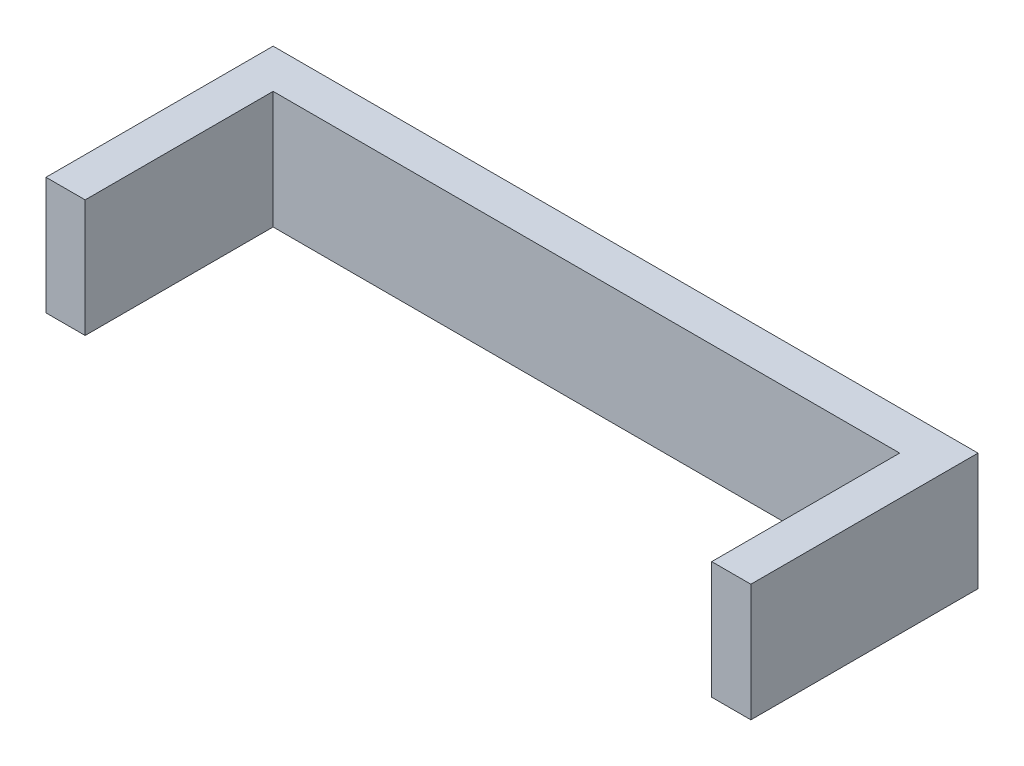
ISO-10303-21;
HEADER;
FILE_DESCRIPTION(('STEP AP214'),'2;1');
FILE_NAME('part.step','',(''),(''),'','','');
FILE_SCHEMA(('AUTOMOTIVE_DESIGN { 1 0 10303 214 1 1 1 1 }'));
ENDSEC;
DATA;
#1=APPLICATION_CONTEXT('core data for automotive mechanical design processes');
#2=APPLICATION_PROTOCOL_DEFINITION('international standard','automotive_design',2000,#1);
#3=PRODUCT_CONTEXT('',#1,'mechanical');
#4=PRODUCT('Part','Part','',(#3));
#5=PRODUCT_RELATED_PRODUCT_CATEGORY('part','',(#4));
#6=PRODUCT_DEFINITION_FORMATION('','',#4);
#7=PRODUCT_DEFINITION_CONTEXT('part definition',#1,'design');
#8=PRODUCT_DEFINITION('design','',#6,#7);
#9=PRODUCT_DEFINITION_SHAPE('','',#8);
#10=(LENGTH_UNIT() NAMED_UNIT(*) SI_UNIT(.MILLI.,.METRE.));
#11=(NAMED_UNIT(*) PLANE_ANGLE_UNIT() SI_UNIT($,.RADIAN.));
#12=(NAMED_UNIT(*) SI_UNIT($,.STERADIAN.) SOLID_ANGLE_UNIT());
#13=UNCERTAINTY_MEASURE_WITH_UNIT(LENGTH_MEASURE(1.E-05),#10,'distance_accuracy_value','');
#14=(GEOMETRIC_REPRESENTATION_CONTEXT(3) GLOBAL_UNCERTAINTY_ASSIGNED_CONTEXT((#13)) GLOBAL_UNIT_ASSIGNED_CONTEXT((#10,
#11,#12)) REPRESENTATION_CONTEXT('',''));
#15=CARTESIAN_POINT('',(0.,0.,0.));
#16=DIRECTION('',(0.,0.,1.));
#17=DIRECTION('',(1.,0.,0.));
#18=AXIS2_PLACEMENT_3D('',#15,#16,#17);
#19=CARTESIAN_POINT('',(0.,25.,0.));
#20=DIRECTION('',(0.,1.,0.));
#21=DIRECTION('',(0.,0.,1.));
#22=AXIS2_PLACEMENT_3D('',#19,#20,#21);
#23=PLANE('',#22);
#24=DIRECTION('',(0.,0.,-1.));
#25=VECTOR('',#24,1.);
#26=CARTESIAN_POINT('',(40.,25.,8.00000000000001));
#27=LINE('',#26,#25);
#28=CARTESIAN_POINT('',(40.,25.,32.));
#29=VERTEX_POINT('',#28);
#30=CARTESIAN_POINT('',(40.,25.,8.00000000000001));
#31=VERTEX_POINT('',#30);
#32=EDGE_CURVE('E147',#29,#31,#27,.T.);
#33=ORIENTED_EDGE('',*,*,#32,.F.);
#34=DIRECTION('',(1.,0.,0.));
#35=VECTOR('',#34,1.);
#36=CARTESIAN_POINT('',(45.,25.,32.));
#37=LINE('',#36,#35);
#38=CARTESIAN_POINT('',(45.,25.,32.));
#39=VERTEX_POINT('',#38);
#40=EDGE_CURVE('E52',#29,#39,#37,.T.);
#41=ORIENTED_EDGE('',*,*,#40,.T.);
#42=DIRECTION('',(0.,0.,-1.));
#43=VECTOR('',#42,1.);
#44=CARTESIAN_POINT('',(45.,25.,32.));
#45=LINE('',#44,#43);
#46=CARTESIAN_POINT('',(45.,25.,3.00000000000001));
#47=VERTEX_POINT('',#46);
#48=EDGE_CURVE('E137',#39,#47,#45,.T.);
#49=ORIENTED_EDGE('',*,*,#48,.T.);
#50=DIRECTION('',(-1.,0.,0.));
#51=VECTOR('',#50,1.);
#52=CARTESIAN_POINT('',(-45.,25.,3.00000000000001));
#53=LINE('',#52,#51);
#54=CARTESIAN_POINT('',(-45.,25.,3.00000000000001));
#55=VERTEX_POINT('',#54);
#56=EDGE_CURVE('E166',#47,#55,#53,.T.);
#57=ORIENTED_EDGE('',*,*,#56,.T.);
#58=DIRECTION('',(0.,0.,1.));
#59=VECTOR('',#58,1.);
#60=CARTESIAN_POINT('',(-45.,25.,-35.));
#61=LINE('',#60,#59);
#62=CARTESIAN_POINT('',(-45.,25.,32.));
#63=VERTEX_POINT('',#62);
#64=EDGE_CURVE('E144',#55,#63,#61,.T.);
#65=ORIENTED_EDGE('',*,*,#64,.T.);
#66=CARTESIAN_POINT('',(-40.,25.,32.));
#67=VERTEX_POINT('',#66);
#68=EDGE_CURVE('E134',#63,#67,#37,.T.);
#69=ORIENTED_EDGE('',*,*,#68,.T.);
#70=DIRECTION('',(0.,0.,1.));
#71=VECTOR('',#70,1.);
#72=CARTESIAN_POINT('',(-40.,25.,8.00000000000001));
#73=LINE('',#72,#71);
#74=CARTESIAN_POINT('',(-40.,25.,8.00000000000001));
#75=VERTEX_POINT('',#74);
#76=EDGE_CURVE('E150',#75,#67,#73,.T.);
#77=ORIENTED_EDGE('',*,*,#76,.F.);
#78=DIRECTION('',(-1.,0.,0.));
#79=VECTOR('',#78,1.);
#80=CARTESIAN_POINT('',(-40.,25.,8.00000000000001));
#81=LINE('',#80,#79);
#82=EDGE_CURVE('E67',#31,#75,#81,.T.);
#83=ORIENTED_EDGE('',*,*,#82,.F.);
#84=EDGE_LOOP('',(#33,#41,#49,#57,#65,#69,#77,#83));
#85=FACE_BOUND('',#84,.T.);
#86=ADVANCED_FACE('F44',(#85),#23,.T.);
#87=CARTESIAN_POINT('',(-35.,10.,-35.));
#88=DIRECTION('',(0.,-1.,0.));
#89=DIRECTION('',(0.,0.,-1.));
#90=AXIS2_PLACEMENT_3D('',#87,#88,#89);
#91=PLANE('',#90);
#92=DIRECTION('',(-1.,0.,0.));
#93=VECTOR('',#92,1.);
#94=CARTESIAN_POINT('',(-40.,10.,8.00000000000001));
#95=LINE('',#94,#93);
#96=CARTESIAN_POINT('',(40.,10.,8.00000000000001));
#97=VERTEX_POINT('',#96);
#98=CARTESIAN_POINT('',(-40.,10.,8.00000000000001));
#99=VERTEX_POINT('',#98);
#100=EDGE_CURVE('E155',#97,#99,#95,.T.);
#101=ORIENTED_EDGE('',*,*,#100,.T.);
#102=DIRECTION('',(0.,0.,1.));
#103=VECTOR('',#102,1.);
#104=CARTESIAN_POINT('',(-40.,10.,8.00000000000001));
#105=LINE('',#104,#103);
#106=CARTESIAN_POINT('',(-40.,10.,32.));
#107=VERTEX_POINT('',#106);
#108=EDGE_CURVE('E78',#99,#107,#105,.T.);
#109=ORIENTED_EDGE('',*,*,#108,.T.);
#110=DIRECTION('',(1.,0.,0.));
#111=VECTOR('',#110,1.);
#112=CARTESIAN_POINT('',(45.,9.99999999999999,32.));
#113=LINE('',#112,#111);
#114=CARTESIAN_POINT('',(-45.,9.99999999999999,32.));
#115=VERTEX_POINT('',#114);
#116=EDGE_CURVE('E114',#115,#107,#113,.T.);
#117=ORIENTED_EDGE('',*,*,#116,.F.);
#118=DIRECTION('',(0.,0.,1.));
#119=VECTOR('',#118,1.);
#120=CARTESIAN_POINT('',(-45.,9.99999999999999,32.));
#121=LINE('',#120,#119);
#122=CARTESIAN_POINT('',(-45.,9.99999999999999,3.00000000000001));
#123=VERTEX_POINT('',#122);
#124=EDGE_CURVE('E117',#123,#115,#121,.T.);
#125=ORIENTED_EDGE('',*,*,#124,.F.);
#126=DIRECTION('',(-1.,0.,0.));
#127=VECTOR('',#126,1.);
#128=CARTESIAN_POINT('',(-45.,10.,3.00000000000001));
#129=LINE('',#128,#127);
#130=CARTESIAN_POINT('',(45.,9.99999999999999,3.00000000000001));
#131=VERTEX_POINT('',#130);
#132=EDGE_CURVE('E146',#131,#123,#129,.T.);
#133=ORIENTED_EDGE('',*,*,#132,.F.);
#134=DIRECTION('',(0.,0.,-1.));
#135=VECTOR('',#134,1.);
#136=CARTESIAN_POINT('',(45.,9.99999999999999,-40.));
#137=LINE('',#136,#135);
#138=CARTESIAN_POINT('',(45.,10.,32.));
#139=VERTEX_POINT('',#138);
#140=EDGE_CURVE('E59',#139,#131,#137,.T.);
#141=ORIENTED_EDGE('',*,*,#140,.F.);
#142=DIRECTION('',(1.,0.,0.));
#143=VECTOR('',#142,1.);
#144=CARTESIAN_POINT('',(-45.,10.,32.));
#145=LINE('',#144,#143);
#146=CARTESIAN_POINT('',(40.,9.99999999999999,32.));
#147=VERTEX_POINT('',#146);
#148=EDGE_CURVE('E12',#147,#139,#145,.T.);
#149=ORIENTED_EDGE('',*,*,#148,.F.);
#150=DIRECTION('',(0.,0.,-1.));
#151=VECTOR('',#150,1.);
#152=CARTESIAN_POINT('',(40.,10.,8.00000000000001));
#153=LINE('',#152,#151);
#154=EDGE_CURVE('E143',#147,#97,#153,.T.);
#155=ORIENTED_EDGE('',*,*,#154,.T.);
#156=EDGE_LOOP('',(#101,#109,#117,#125,#133,#141,#149,#155));
#157=FACE_BOUND('',#156,.T.);
#158=ADVANCED_FACE('F116',(#157),#91,.T.);
#159=CARTESIAN_POINT('',(-45.,-146.026871105171,32.));
#160=DIRECTION('',(0.,0.,1.));
#161=DIRECTION('',(1.,0.,0.));
#162=AXIS2_PLACEMENT_3D('',#159,#160,#161);
#163=PLANE('',#162);
#164=DIRECTION('',(0.,1.,0.));
#165=VECTOR('',#164,1.);
#166=CARTESIAN_POINT('',(-45.,-146.026871105171,32.));
#167=LINE('',#166,#165);
#168=EDGE_CURVE('E125',#115,#63,#167,.T.);
#169=ORIENTED_EDGE('',*,*,#168,.F.);
#170=ORIENTED_EDGE('',*,*,#116,.T.);
#171=DIRECTION('',(0.,-1.,0.));
#172=VECTOR('',#171,1.);
#173=CARTESIAN_POINT('',(-40.,25.,32.));
#174=LINE('',#173,#172);
#175=EDGE_CURVE('E159',#67,#107,#174,.T.);
#176=ORIENTED_EDGE('',*,*,#175,.F.);
#177=ORIENTED_EDGE('',*,*,#68,.F.);
#178=EDGE_LOOP('',(#169,#170,#176,#177));
#179=FACE_BOUND('',#178,.T.);
#180=ADVANCED_FACE('F132',(#179),#163,.T.);
#181=CARTESIAN_POINT('',(-45.,-146.026871105171,-40.));
#182=DIRECTION('',(-1.,0.,0.));
#183=DIRECTION('',(0.,0.,1.));
#184=AXIS2_PLACEMENT_3D('',#181,#182,#183);
#185=PLANE('',#184);
#186=DIRECTION('',(0.,-1.,0.));
#187=VECTOR('',#186,1.);
#188=CARTESIAN_POINT('',(-45.,25.,3.00000000000001));
#189=LINE('',#188,#187);
#190=EDGE_CURVE('E128',#55,#123,#189,.T.);
#191=ORIENTED_EDGE('',*,*,#190,.T.);
#192=ORIENTED_EDGE('',*,*,#124,.T.);
#193=ORIENTED_EDGE('',*,*,#168,.T.);
#194=ORIENTED_EDGE('',*,*,#64,.F.);
#195=EDGE_LOOP('',(#191,#192,#193,#194));
#196=FACE_BOUND('',#195,.T.);
#197=ADVANCED_FACE('F124',(#196),#185,.T.);
#198=CARTESIAN_POINT('',(-40.,25.,8.00000000000001));
#199=DIRECTION('',(1.,0.,0.));
#200=DIRECTION('',(0.,0.,-1.));
#201=AXIS2_PLACEMENT_3D('',#198,#199,#200);
#202=PLANE('',#201);
#203=ORIENTED_EDGE('',*,*,#108,.F.);
#204=DIRECTION('',(0.,-1.,0.));
#205=VECTOR('',#204,1.);
#206=CARTESIAN_POINT('',(-40.,25.,8.00000000000001));
#207=LINE('',#206,#205);
#208=EDGE_CURVE('E161',#75,#99,#207,.T.);
#209=ORIENTED_EDGE('',*,*,#208,.F.);
#210=ORIENTED_EDGE('',*,*,#76,.T.);
#211=ORIENTED_EDGE('',*,*,#175,.T.);
#212=EDGE_LOOP('',(#203,#209,#210,#211));
#213=FACE_BOUND('',#212,.T.);
#214=ADVANCED_FACE('F195',(#213),#202,.T.);
#215=CARTESIAN_POINT('',(-40.,25.,8.00000000000001));
#216=DIRECTION('',(0.,0.,1.));
#217=DIRECTION('',(1.,0.,0.));
#218=AXIS2_PLACEMENT_3D('',#215,#216,#217);
#219=PLANE('',#218);
#220=ORIENTED_EDGE('',*,*,#100,.F.);
#221=DIRECTION('',(0.,-1.,0.));
#222=VECTOR('',#221,1.);
#223=CARTESIAN_POINT('',(40.,25.,8.00000000000001));
#224=LINE('',#223,#222);
#225=EDGE_CURVE('E163',#31,#97,#224,.T.);
#226=ORIENTED_EDGE('',*,*,#225,.F.);
#227=ORIENTED_EDGE('',*,*,#82,.T.);
#228=ORIENTED_EDGE('',*,*,#208,.T.);
#229=EDGE_LOOP('',(#220,#226,#227,#228));
#230=FACE_BOUND('',#229,.T.);
#231=ADVANCED_FACE('F185',(#230),#219,.T.);
#232=DIRECTION('',(0.,-1.,0.));
#233=VECTOR('',#232,1.);
#234=CARTESIAN_POINT('',(40.,25.,32.));
#235=LINE('',#234,#233);
#236=EDGE_CURVE('E153',#29,#147,#235,.T.);
#237=ORIENTED_EDGE('',*,*,#236,.T.);
#238=ORIENTED_EDGE('',*,*,#148,.T.);
#239=DIRECTION('',(0.,1.,0.));
#240=VECTOR('',#239,1.);
#241=CARTESIAN_POINT('',(45.,-146.026871105171,32.));
#242=LINE('',#241,#240);
#243=EDGE_CURVE('E130',#139,#39,#242,.T.);
#244=ORIENTED_EDGE('',*,*,#243,.T.);
#245=ORIENTED_EDGE('',*,*,#40,.F.);
#246=EDGE_LOOP('',(#237,#238,#244,#245));
#247=FACE_BOUND('',#246,.T.);
#248=ADVANCED_FACE('F186',(#247),#163,.T.);
#249=CARTESIAN_POINT('',(45.,-146.026871105171,32.));
#250=DIRECTION('',(1.,0.,0.));
#251=DIRECTION('',(0.,0.,-1.));
#252=AXIS2_PLACEMENT_3D('',#249,#250,#251);
#253=PLANE('',#252);
#254=ORIENTED_EDGE('',*,*,#243,.F.);
#255=ORIENTED_EDGE('',*,*,#140,.T.);
#256=DIRECTION('',(0.,-1.,0.));
#257=VECTOR('',#256,1.);
#258=CARTESIAN_POINT('',(45.,25.,3.00000000000001));
#259=LINE('',#258,#257);
#260=EDGE_CURVE('E170',#47,#131,#259,.T.);
#261=ORIENTED_EDGE('',*,*,#260,.F.);
#262=ORIENTED_EDGE('',*,*,#48,.F.);
#263=EDGE_LOOP('',(#254,#255,#261,#262));
#264=FACE_BOUND('',#263,.T.);
#265=ADVANCED_FACE('F177',(#264),#253,.T.);
#266=CARTESIAN_POINT('',(40.,25.,8.00000000000001));
#267=DIRECTION('',(-1.,0.,0.));
#268=DIRECTION('',(0.,0.,1.));
#269=AXIS2_PLACEMENT_3D('',#266,#267,#268);
#270=PLANE('',#269);
#271=ORIENTED_EDGE('',*,*,#154,.F.);
#272=ORIENTED_EDGE('',*,*,#236,.F.);
#273=ORIENTED_EDGE('',*,*,#32,.T.);
#274=ORIENTED_EDGE('',*,*,#225,.T.);
#275=EDGE_LOOP('',(#271,#272,#273,#274));
#276=FACE_BOUND('',#275,.T.);
#277=ADVANCED_FACE('F183',(#276),#270,.T.);
#278=CARTESIAN_POINT('',(-42.,0.,3.00000000000001));
#279=DIRECTION('',(0.,0.,1.));
#280=DIRECTION('',(1.,0.,0.));
#281=AXIS2_PLACEMENT_3D('',#278,#279,#280);
#282=PLANE('',#281);
#283=ORIENTED_EDGE('',*,*,#260,.T.);
#284=ORIENTED_EDGE('',*,*,#132,.T.);
#285=ORIENTED_EDGE('',*,*,#190,.F.);
#286=ORIENTED_EDGE('',*,*,#56,.F.);
#287=EDGE_LOOP('',(#283,#284,#285,#286));
#288=FACE_BOUND('',#287,.T.);
#289=ADVANCED_FACE('F46',(#288),#282,.F.);
#290=CLOSED_SHELL('',(#86,#158,#180,#197,#214,#231,#248,#265,#277,#289));
#291=MANIFOLD_SOLID_BREP('B2',#290);
#292=ADVANCED_BREP_SHAPE_REPRESENTATION('',(#18,#291),#14);
#293=SHAPE_DEFINITION_REPRESENTATION(#9,#292);
ENDSEC;
END-ISO-10303-21;
